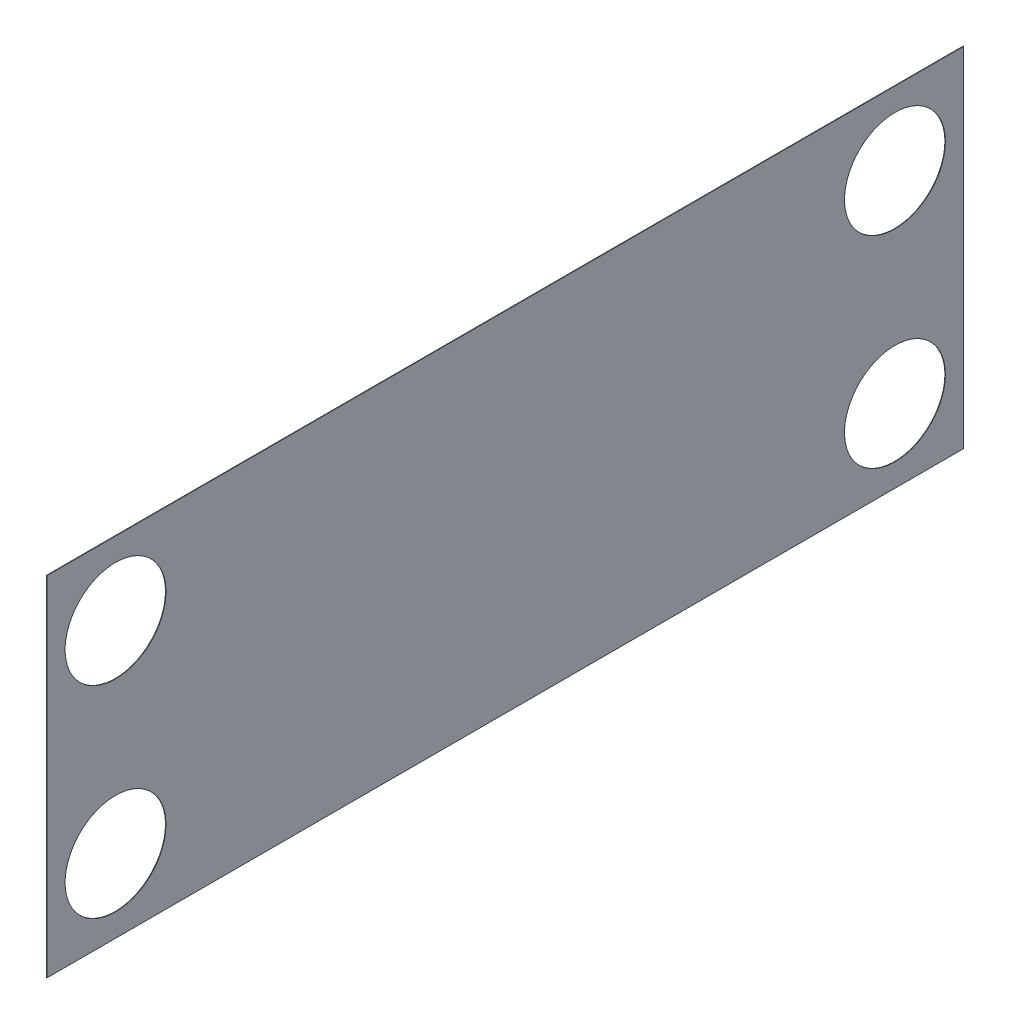
ISO-10303-21;
HEADER;
FILE_DESCRIPTION(('STEP AP214'),'2;1');
FILE_NAME('part.step','',(''),(''),'','','');
FILE_SCHEMA(('AUTOMOTIVE_DESIGN { 1 0 10303 214 1 1 1 1 }'));
ENDSEC;
DATA;
#1=APPLICATION_CONTEXT('core data for automotive mechanical design processes');
#2=APPLICATION_PROTOCOL_DEFINITION('international standard','automotive_design',2000,#1);
#3=PRODUCT_CONTEXT('',#1,'mechanical');
#4=PRODUCT('Part','Part','',(#3));
#5=PRODUCT_RELATED_PRODUCT_CATEGORY('part','',(#4));
#6=PRODUCT_DEFINITION_FORMATION('','',#4);
#7=PRODUCT_DEFINITION_CONTEXT('part definition',#1,'design');
#8=PRODUCT_DEFINITION('design','',#6,#7);
#9=PRODUCT_DEFINITION_SHAPE('','',#8);
#10=(LENGTH_UNIT() NAMED_UNIT(*) SI_UNIT(.MILLI.,.METRE.));
#11=(NAMED_UNIT(*) PLANE_ANGLE_UNIT() SI_UNIT($,.RADIAN.));
#12=(NAMED_UNIT(*) SI_UNIT($,.STERADIAN.) SOLID_ANGLE_UNIT());
#13=UNCERTAINTY_MEASURE_WITH_UNIT(LENGTH_MEASURE(1.E-05),#10,'distance_accuracy_value','');
#14=(GEOMETRIC_REPRESENTATION_CONTEXT(3) GLOBAL_UNCERTAINTY_ASSIGNED_CONTEXT((#13)) GLOBAL_UNIT_ASSIGNED_CONTEXT((#10,
#11,#12)) REPRESENTATION_CONTEXT('',''));
#15=CARTESIAN_POINT('',(0.,0.,0.));
#16=DIRECTION('',(0.,0.,1.));
#17=DIRECTION('',(1.,0.,0.));
#18=AXIS2_PLACEMENT_3D('',#15,#16,#17);
#19=CARTESIAN_POINT('',(0.0508,19.,50.));
#20=DIRECTION('',(0.,0.,-1.));
#21=DIRECTION('',(-1.,0.,0.));
#22=AXIS2_PLACEMENT_3D('',#19,#20,#21);
#23=PLANE('',#22);
#24=DIRECTION('',(0.,-1.,0.));
#25=VECTOR('',#24,1.);
#26=CARTESIAN_POINT('',(0.,19.,50.));
#27=LINE('',#26,#25);
#28=CARTESIAN_POINT('',(0.,19.,50.));
#29=VERTEX_POINT('',#28);
#30=CARTESIAN_POINT('',(0.,-19.,50.));
#31=VERTEX_POINT('',#30);
#32=EDGE_CURVE('E97',#29,#31,#27,.T.);
#33=ORIENTED_EDGE('',*,*,#32,.T.);
#34=DIRECTION('',(-1.,0.,0.));
#35=VECTOR('',#34,1.);
#36=CARTESIAN_POINT('',(0.0508,-19.,50.));
#37=LINE('',#36,#35);
#38=CARTESIAN_POINT('',(0.0508,-19.,50.));
#39=VERTEX_POINT('',#38);
#40=EDGE_CURVE('E11',#39,#31,#37,.T.);
#41=ORIENTED_EDGE('',*,*,#40,.F.);
#42=DIRECTION('',(0.,-1.,0.));
#43=VECTOR('',#42,1.);
#44=CARTESIAN_POINT('',(0.0508,19.,50.));
#45=LINE('',#44,#43);
#46=CARTESIAN_POINT('',(0.0508,19.,50.));
#47=VERTEX_POINT('',#46);
#48=EDGE_CURVE('E85',#47,#39,#45,.T.);
#49=ORIENTED_EDGE('',*,*,#48,.F.);
#50=DIRECTION('',(-1.,0.,0.));
#51=VECTOR('',#50,1.);
#52=CARTESIAN_POINT('',(0.0508,19.,50.));
#53=LINE('',#52,#51);
#54=EDGE_CURVE('E93',#47,#29,#53,.T.);
#55=ORIENTED_EDGE('',*,*,#54,.T.);
#56=EDGE_LOOP('',(#33,#41,#49,#55));
#57=FACE_BOUND('',#56,.T.);
#58=ADVANCED_FACE('F34',(#57),#23,.F.);
#59=CARTESIAN_POINT('',(0.0508,-19.,50.));
#60=DIRECTION('',(0.,1.,0.));
#61=DIRECTION('',(0.,0.,1.));
#62=AXIS2_PLACEMENT_3D('',#59,#60,#61);
#63=PLANE('',#62);
#64=DIRECTION('',(0.,0.,-1.));
#65=VECTOR('',#64,1.);
#66=CARTESIAN_POINT('',(0.,-19.,50.));
#67=LINE('',#66,#65);
#68=CARTESIAN_POINT('',(0.,-19.,-50.));
#69=VERTEX_POINT('',#68);
#70=EDGE_CURVE('E89',#31,#69,#67,.T.);
#71=ORIENTED_EDGE('',*,*,#70,.T.);
#72=DIRECTION('',(-1.,0.,0.));
#73=VECTOR('',#72,1.);
#74=CARTESIAN_POINT('',(0.0508,-19.,-50.));
#75=LINE('',#74,#73);
#76=CARTESIAN_POINT('',(0.0508,-19.,-50.));
#77=VERTEX_POINT('',#76);
#78=EDGE_CURVE('E42',#77,#69,#75,.T.);
#79=ORIENTED_EDGE('',*,*,#78,.F.);
#80=DIRECTION('',(0.,0.,-1.));
#81=VECTOR('',#80,1.);
#82=CARTESIAN_POINT('',(0.0508,-19.,50.));
#83=LINE('',#82,#81);
#84=EDGE_CURVE('E80',#39,#77,#83,.T.);
#85=ORIENTED_EDGE('',*,*,#84,.F.);
#86=ORIENTED_EDGE('',*,*,#40,.T.);
#87=EDGE_LOOP('',(#71,#79,#85,#86));
#88=FACE_BOUND('',#87,.T.);
#89=ADVANCED_FACE('F88',(#88),#63,.F.);
#90=CARTESIAN_POINT('',(0.0508,19.,-50.));
#91=DIRECTION('',(0.,0.,1.));
#92=DIRECTION('',(1.,0.,0.));
#93=AXIS2_PLACEMENT_3D('',#90,#91,#92);
#94=PLANE('',#93);
#95=DIRECTION('',(0.,1.,0.));
#96=VECTOR('',#95,1.);
#97=CARTESIAN_POINT('',(0.,19.,-50.));
#98=LINE('',#97,#96);
#99=CARTESIAN_POINT('',(0.,19.,-50.));
#100=VERTEX_POINT('',#99);
#101=EDGE_CURVE('E67',#69,#100,#98,.T.);
#102=ORIENTED_EDGE('',*,*,#101,.T.);
#103=DIRECTION('',(-1.,0.,0.));
#104=VECTOR('',#103,1.);
#105=CARTESIAN_POINT('',(0.0508,19.,-50.));
#106=LINE('',#105,#104);
#107=CARTESIAN_POINT('',(0.0508,19.,-50.));
#108=VERTEX_POINT('',#107);
#109=EDGE_CURVE('E90',#108,#100,#106,.T.);
#110=ORIENTED_EDGE('',*,*,#109,.F.);
#111=DIRECTION('',(0.,1.,0.));
#112=VECTOR('',#111,1.);
#113=CARTESIAN_POINT('',(0.0508,19.,-50.));
#114=LINE('',#113,#112);
#115=EDGE_CURVE('E83',#77,#108,#114,.T.);
#116=ORIENTED_EDGE('',*,*,#115,.F.);
#117=ORIENTED_EDGE('',*,*,#78,.T.);
#118=EDGE_LOOP('',(#102,#110,#116,#117));
#119=FACE_BOUND('',#118,.T.);
#120=ADVANCED_FACE('F91',(#119),#94,.F.);
#121=CARTESIAN_POINT('',(0.0508,19.,50.));
#122=DIRECTION('',(0.,-1.,0.));
#123=DIRECTION('',(0.,0.,-1.));
#124=AXIS2_PLACEMENT_3D('',#121,#122,#123);
#125=PLANE('',#124);
#126=DIRECTION('',(0.,0.,1.));
#127=VECTOR('',#126,1.);
#128=CARTESIAN_POINT('',(0.,19.,50.));
#129=LINE('',#128,#127);
#130=EDGE_CURVE('E73',#100,#29,#129,.T.);
#131=ORIENTED_EDGE('',*,*,#130,.T.);
#132=ORIENTED_EDGE('',*,*,#54,.F.);
#133=DIRECTION('',(0.,0.,1.));
#134=VECTOR('',#133,1.);
#135=CARTESIAN_POINT('',(0.0508,19.,50.));
#136=LINE('',#135,#134);
#137=EDGE_CURVE('E50',#108,#47,#136,.T.);
#138=ORIENTED_EDGE('',*,*,#137,.F.);
#139=ORIENTED_EDGE('',*,*,#109,.T.);
#140=EDGE_LOOP('',(#131,#132,#138,#139));
#141=FACE_BOUND('',#140,.T.);
#142=ADVANCED_FACE('F105',(#141),#125,.F.);
#143=CARTESIAN_POINT('',(0.0508,0.,0.));
#144=DIRECTION('',(1.,0.,0.));
#145=DIRECTION('',(0.,0.,-1.));
#146=AXIS2_PLACEMENT_3D('',#143,#144,#145);
#147=PLANE('',#146);
#148=CARTESIAN_POINT('',(0.0508000000000009,11.,42.5));
#149=DIRECTION('',(1.,0.,0.));
#150=DIRECTION('',(0.,0.,-1.));
#151=AXIS2_PLACEMENT_3D('',#148,#149,#150);
#152=CIRCLE('',#151,5.49999999999999);
#153=CARTESIAN_POINT('',(0.0508000000000009,11.,37.));
#154=VERTEX_POINT('',#153);
#155=EDGE_CURVE('E131',#154,#154,#152,.T.);
#156=ORIENTED_EDGE('',*,*,#155,.F.);
#157=EDGE_LOOP('',(#156));
#158=FACE_BOUND('',#157,.T.);
#159=CARTESIAN_POINT('',(0.0508000000000009,-11.,42.5));
#160=DIRECTION('',(1.,0.,0.));
#161=DIRECTION('',(0.,0.,-1.));
#162=AXIS2_PLACEMENT_3D('',#159,#160,#161);
#163=CIRCLE('',#162,5.49999999999999);
#164=CARTESIAN_POINT('',(0.0508000000000009,-11.,37.));
#165=VERTEX_POINT('',#164);
#166=EDGE_CURVE('E125',#165,#165,#163,.T.);
#167=ORIENTED_EDGE('',*,*,#166,.F.);
#168=EDGE_LOOP('',(#167));
#169=FACE_BOUND('',#168,.T.);
#170=CARTESIAN_POINT('',(0.0508000000000009,11.,-42.5));
#171=DIRECTION('',(1.,0.,0.));
#172=DIRECTION('',(0.,0.,-1.));
#173=AXIS2_PLACEMENT_3D('',#170,#171,#172);
#174=CIRCLE('',#173,5.49999999999999);
#175=CARTESIAN_POINT('',(0.0508000000000009,11.,-48.));
#176=VERTEX_POINT('',#175);
#177=EDGE_CURVE('E119',#176,#176,#174,.T.);
#178=ORIENTED_EDGE('',*,*,#177,.F.);
#179=EDGE_LOOP('',(#178));
#180=FACE_BOUND('',#179,.T.);
#181=CARTESIAN_POINT('',(0.0508000000000009,-11.,-42.5));
#182=DIRECTION('',(1.,0.,0.));
#183=DIRECTION('',(0.,0.,-1.));
#184=AXIS2_PLACEMENT_3D('',#181,#182,#183);
#185=CIRCLE('',#184,5.49999999999999);
#186=CARTESIAN_POINT('',(0.0508000000000009,-11.,-48.));
#187=VERTEX_POINT('',#186);
#188=EDGE_CURVE('E113',#187,#187,#185,.T.);
#189=ORIENTED_EDGE('',*,*,#188,.F.);
#190=EDGE_LOOP('',(#189));
#191=FACE_BOUND('',#190,.T.);
#192=ORIENTED_EDGE('',*,*,#48,.T.);
#193=ORIENTED_EDGE('',*,*,#84,.T.);
#194=ORIENTED_EDGE('',*,*,#115,.T.);
#195=ORIENTED_EDGE('',*,*,#137,.T.);
#196=EDGE_LOOP('',(#192,#193,#194,#195));
#197=FACE_BOUND('',#196,.T.);
#198=ADVANCED_FACE('F81',(#158,#169,#180,#191,#197),#147,.T.);
#199=CARTESIAN_POINT('',(0.,0.,0.));
#200=DIRECTION('',(1.,0.,0.));
#201=DIRECTION('',(0.,0.,-1.));
#202=AXIS2_PLACEMENT_3D('',#199,#200,#201);
#203=PLANE('',#202);
#204=CARTESIAN_POINT('',(0.,11.,42.5));
#205=DIRECTION('',(1.,0.,0.));
#206=DIRECTION('',(0.,0.,-1.));
#207=AXIS2_PLACEMENT_3D('',#204,#205,#206);
#208=CIRCLE('',#207,5.5);
#209=CARTESIAN_POINT('',(0.,11.,37.));
#210=VERTEX_POINT('',#209);
#211=EDGE_CURVE('E128',#210,#210,#208,.T.);
#212=ORIENTED_EDGE('',*,*,#211,.T.);
#213=EDGE_LOOP('',(#212));
#214=FACE_BOUND('',#213,.T.);
#215=CARTESIAN_POINT('',(0.,-11.,42.5));
#216=DIRECTION('',(1.,0.,0.));
#217=DIRECTION('',(0.,0.,-1.));
#218=AXIS2_PLACEMENT_3D('',#215,#216,#217);
#219=CIRCLE('',#218,5.5);
#220=CARTESIAN_POINT('',(0.,-11.,37.));
#221=VERTEX_POINT('',#220);
#222=EDGE_CURVE('E122',#221,#221,#219,.T.);
#223=ORIENTED_EDGE('',*,*,#222,.T.);
#224=EDGE_LOOP('',(#223));
#225=FACE_BOUND('',#224,.T.);
#226=CARTESIAN_POINT('',(0.,11.,-42.5));
#227=DIRECTION('',(1.,0.,0.));
#228=DIRECTION('',(0.,0.,-1.));
#229=AXIS2_PLACEMENT_3D('',#226,#227,#228);
#230=CIRCLE('',#229,5.5);
#231=CARTESIAN_POINT('',(0.,11.,-48.));
#232=VERTEX_POINT('',#231);
#233=EDGE_CURVE('E116',#232,#232,#230,.T.);
#234=ORIENTED_EDGE('',*,*,#233,.T.);
#235=EDGE_LOOP('',(#234));
#236=FACE_BOUND('',#235,.T.);
#237=CARTESIAN_POINT('',(0.,-11.,-42.5));
#238=DIRECTION('',(1.,0.,0.));
#239=DIRECTION('',(0.,0.,-1.));
#240=AXIS2_PLACEMENT_3D('',#237,#238,#239);
#241=CIRCLE('',#240,5.5);
#242=CARTESIAN_POINT('',(0.,-11.,-48.));
#243=VERTEX_POINT('',#242);
#244=EDGE_CURVE('E100',#243,#243,#241,.T.);
#245=ORIENTED_EDGE('',*,*,#244,.T.);
#246=EDGE_LOOP('',(#245));
#247=FACE_BOUND('',#246,.T.);
#248=ORIENTED_EDGE('',*,*,#32,.F.);
#249=ORIENTED_EDGE('',*,*,#130,.F.);
#250=ORIENTED_EDGE('',*,*,#101,.F.);
#251=ORIENTED_EDGE('',*,*,#70,.F.);
#252=EDGE_LOOP('',(#248,#249,#250,#251));
#253=FACE_BOUND('',#252,.T.);
#254=ADVANCED_FACE('F108',(#214,#225,#236,#247,#253),#203,.F.);
#255=CARTESIAN_POINT('',(0.0508,-11.,-42.5));
#256=DIRECTION('',(1.,0.,0.));
#257=DIRECTION('',(0.,0.,-1.));
#258=AXIS2_PLACEMENT_3D('',#255,#256,#257);
#259=CYLINDRICAL_SURFACE('',#258,5.49999999999999);
#260=ORIENTED_EDGE('',*,*,#244,.F.);
#261=EDGE_LOOP('',(#260));
#262=FACE_BOUND('',#261,.T.);
#263=ORIENTED_EDGE('',*,*,#188,.T.);
#264=EDGE_LOOP('',(#263));
#265=FACE_BOUND('',#264,.T.);
#266=ADVANCED_FACE('F146',(#262,#265),#259,.F.);
#267=CARTESIAN_POINT('',(0.0508,11.,-42.5));
#268=DIRECTION('',(1.,0.,0.));
#269=DIRECTION('',(0.,0.,-1.));
#270=AXIS2_PLACEMENT_3D('',#267,#268,#269);
#271=CYLINDRICAL_SURFACE('',#270,5.49999999999999);
#272=ORIENTED_EDGE('',*,*,#233,.F.);
#273=EDGE_LOOP('',(#272));
#274=FACE_BOUND('',#273,.T.);
#275=ORIENTED_EDGE('',*,*,#177,.T.);
#276=EDGE_LOOP('',(#275));
#277=FACE_BOUND('',#276,.T.);
#278=ADVANCED_FACE('F148',(#274,#277),#271,.F.);
#279=CARTESIAN_POINT('',(0.0508,-11.,42.5));
#280=DIRECTION('',(1.,0.,0.));
#281=DIRECTION('',(0.,0.,-1.));
#282=AXIS2_PLACEMENT_3D('',#279,#280,#281);
#283=CYLINDRICAL_SURFACE('',#282,5.49999999999999);
#284=ORIENTED_EDGE('',*,*,#222,.F.);
#285=EDGE_LOOP('',(#284));
#286=FACE_BOUND('',#285,.T.);
#287=ORIENTED_EDGE('',*,*,#166,.T.);
#288=EDGE_LOOP('',(#287));
#289=FACE_BOUND('',#288,.T.);
#290=ADVANCED_FACE('F155',(#286,#289),#283,.F.);
#291=CARTESIAN_POINT('',(0.0508,11.,42.5));
#292=DIRECTION('',(1.,0.,0.));
#293=DIRECTION('',(0.,0.,-1.));
#294=AXIS2_PLACEMENT_3D('',#291,#292,#293);
#295=CYLINDRICAL_SURFACE('',#294,5.49999999999999);
#296=ORIENTED_EDGE('',*,*,#211,.F.);
#297=EDGE_LOOP('',(#296));
#298=FACE_BOUND('',#297,.T.);
#299=ORIENTED_EDGE('',*,*,#155,.T.);
#300=EDGE_LOOP('',(#299));
#301=FACE_BOUND('',#300,.T.);
#302=ADVANCED_FACE('F135',(#298,#301),#295,.F.);
#303=CLOSED_SHELL('',(#58,#89,#120,#142,#198,#254,#266,#278,#290,#302));
#304=MANIFOLD_SOLID_BREP('B2',#303);
#305=ADVANCED_BREP_SHAPE_REPRESENTATION('',(#18,#304),#14);
#306=SHAPE_DEFINITION_REPRESENTATION(#9,#305);
ENDSEC;
END-ISO-10303-21;
